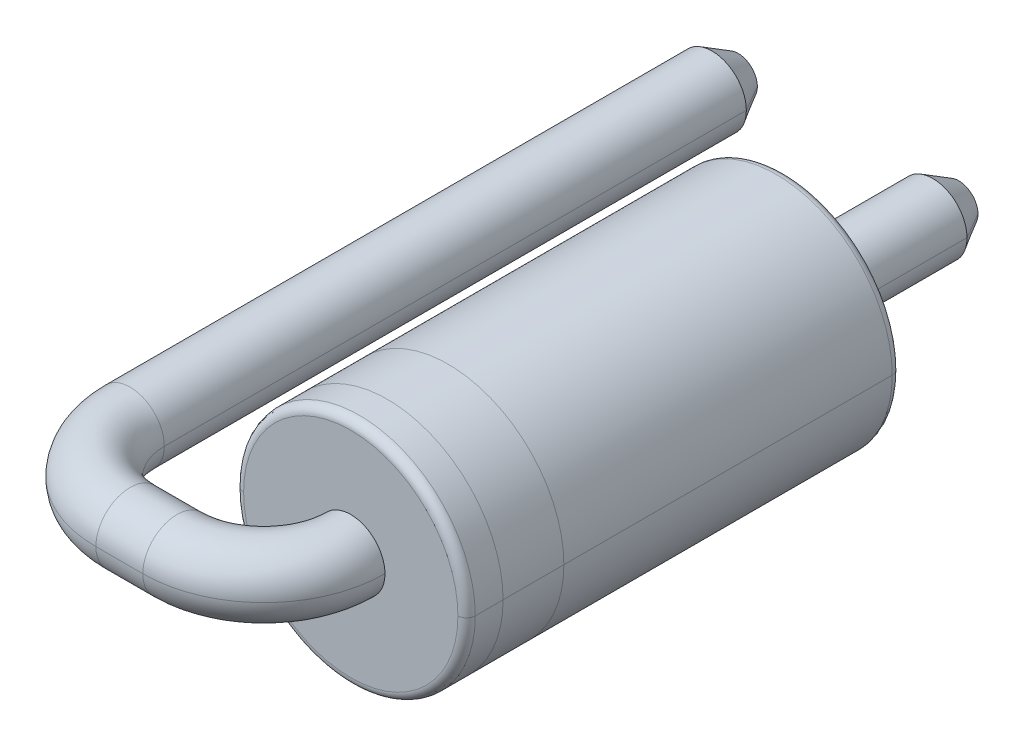
ISO-10303-21;
HEADER;
FILE_DESCRIPTION(('STEP AP214'),'2;1');
FILE_NAME('part.step','',(''),(''),'','','');
FILE_SCHEMA(('AUTOMOTIVE_DESIGN { 1 0 10303 214 1 1 1 1 }'));
ENDSEC;
DATA;
#1=APPLICATION_CONTEXT('core data for automotive mechanical design processes');
#2=APPLICATION_PROTOCOL_DEFINITION('international standard','automotive_design',2000,#1);
#3=PRODUCT_CONTEXT('',#1,'mechanical');
#4=PRODUCT('Part','Part','',(#3));
#5=PRODUCT_RELATED_PRODUCT_CATEGORY('part','',(#4));
#6=PRODUCT_DEFINITION_FORMATION('','',#4);
#7=PRODUCT_DEFINITION_CONTEXT('part definition',#1,'design');
#8=PRODUCT_DEFINITION('design','',#6,#7);
#9=PRODUCT_DEFINITION_SHAPE('','',#8);
#10=(LENGTH_UNIT() NAMED_UNIT(*) SI_UNIT(.MILLI.,.METRE.));
#11=(NAMED_UNIT(*) PLANE_ANGLE_UNIT() SI_UNIT($,.RADIAN.));
#12=(NAMED_UNIT(*) SI_UNIT($,.STERADIAN.) SOLID_ANGLE_UNIT());
#13=UNCERTAINTY_MEASURE_WITH_UNIT(LENGTH_MEASURE(1.E-05),#10,'distance_accuracy_value','');
#14=(GEOMETRIC_REPRESENTATION_CONTEXT(3) GLOBAL_UNCERTAINTY_ASSIGNED_CONTEXT((#13)) GLOBAL_UNIT_ASSIGNED_CONTEXT((#10,
#11,#12)) REPRESENTATION_CONTEXT('',''));
#15=CARTESIAN_POINT('',(0.,0.,0.));
#16=DIRECTION('',(0.,0.,1.));
#17=DIRECTION('',(1.,0.,0.));
#18=AXIS2_PLACEMENT_3D('',#15,#16,#17);
#19=CARTESIAN_POINT('',(0.308079680000001,-0.0636016000000001,4.99999892));
#20=DIRECTION('',(0.,-1.,0.));
#21=DIRECTION('',(0.,0.,-1.));
#22=AXIS2_PLACEMENT_3D('',#19,#20,#21);
#23=TOROIDAL_SURFACE('',#22,1.,0.393699999999999);
#24=CARTESIAN_POINT('',(1.30807968,-0.0636016000000003,4.99999892));
#25=DIRECTION('',(0.,0.,1.));
#26=DIRECTION('',(1.,0.,0.));
#27=AXIS2_PLACEMENT_3D('',#24,#25,#26);
#28=CIRCLE('',#27,0.393699999999999);
#29=CARTESIAN_POINT('',(0.914379680000001,-0.0636016000000002,4.99999892));
#30=VERTEX_POINT('',#29);
#31=CARTESIAN_POINT('',(1.70177968,-0.0636016000000004,4.99999892));
#32=VERTEX_POINT('',#31);
#33=EDGE_CURVE('E11',#30,#32,#28,.T.);
#34=ORIENTED_EDGE('',*,*,#33,.T.);
#35=CARTESIAN_POINT('',(0.308079680000001,-0.0636016000000001,4.99999892));
#36=DIRECTION('',(0.,-1.,0.));
#37=DIRECTION('',(0.,0.,-1.));
#38=AXIS2_PLACEMENT_3D('',#35,#36,#37);
#39=CIRCLE('',#38,1.3937);
#40=CARTESIAN_POINT('',(0.30807968,-0.0636016000000001,6.39369892));
#41=VERTEX_POINT('',#40);
#42=EDGE_CURVE('E23',#32,#41,#39,.T.);
#43=ORIENTED_EDGE('',*,*,#42,.T.);
#44=CARTESIAN_POINT('',(0.30807968,-0.0636016000000001,5.99999892));
#45=DIRECTION('',(-1.,0.,0.));
#46=DIRECTION('',(0.,0.,1.));
#47=AXIS2_PLACEMENT_3D('',#44,#45,#46);
#48=CIRCLE('',#47,0.393699999999999);
#49=CARTESIAN_POINT('',(0.30807968,-0.0636016,5.60629892));
#50=VERTEX_POINT('',#49);
#51=EDGE_CURVE('E256',#50,#41,#48,.T.);
#52=ORIENTED_EDGE('',*,*,#51,.F.);
#53=CARTESIAN_POINT('',(0.308079680000001,-0.0636016,4.99999892));
#54=DIRECTION('',(0.,-1.,0.));
#55=DIRECTION('',(0.,0.,-1.));
#56=AXIS2_PLACEMENT_3D('',#53,#54,#55);
#57=CIRCLE('',#56,0.606300000000001);
#58=EDGE_CURVE('E253',#30,#50,#57,.T.);
#59=ORIENTED_EDGE('',*,*,#58,.F.);
#60=EDGE_LOOP('',(#34,#43,#52,#59));
#61=FACE_BOUND('',#60,.T.);
#62=ADVANCED_FACE('F16',(#61),#23,.T.);
#63=CARTESIAN_POINT('',(-0.231920319999998,-0.0636015999999999,4.99999892));
#64=DIRECTION('',(0.,-1.,0.));
#65=DIRECTION('',(0.,0.,-1.));
#66=AXIS2_PLACEMENT_3D('',#63,#64,#65);
#67=TOROIDAL_SURFACE('',#66,1.,0.393699999999999);
#68=CARTESIAN_POINT('',(-0.231920319999999,-0.0636015999999999,5.99999892));
#69=DIRECTION('',(-1.,0.,0.));
#70=DIRECTION('',(0.,0.,1.));
#71=AXIS2_PLACEMENT_3D('',#68,#69,#70);
#72=CIRCLE('',#71,0.393699999999999);
#73=CARTESIAN_POINT('',(-0.231920319999999,-0.0636015999999999,5.60629892));
#74=VERTEX_POINT('',#73);
#75=CARTESIAN_POINT('',(-0.231920319999999,-0.0636015999999999,6.39369892));
#76=VERTEX_POINT('',#75);
#77=EDGE_CURVE('E251',#74,#76,#72,.T.);
#78=ORIENTED_EDGE('',*,*,#77,.T.);
#79=CARTESIAN_POINT('',(-0.231920319999998,-0.0636015999999999,4.99999892));
#80=DIRECTION('',(0.,-1.,0.));
#81=DIRECTION('',(0.,0.,-1.));
#82=AXIS2_PLACEMENT_3D('',#79,#80,#81);
#83=CIRCLE('',#82,1.3937);
#84=CARTESIAN_POINT('',(-1.62562032,-0.0636015999999996,4.99999892));
#85=VERTEX_POINT('',#84);
#86=EDGE_CURVE('E249',#76,#85,#83,.T.);
#87=ORIENTED_EDGE('',*,*,#86,.T.);
#88=CARTESIAN_POINT('',(-1.23192032,-0.0636015999999997,4.99999892));
#89=DIRECTION('',(0.,0.,-1.));
#90=DIRECTION('',(-1.,0.,0.));
#91=AXIS2_PLACEMENT_3D('',#88,#89,#90);
#92=CIRCLE('',#91,0.393699999999999);
#93=CARTESIAN_POINT('',(-0.838220320000001,-0.0636015999999997,4.99999892));
#94=VERTEX_POINT('',#93);
#95=EDGE_CURVE('E247',#94,#85,#92,.T.);
#96=ORIENTED_EDGE('',*,*,#95,.F.);
#97=CARTESIAN_POINT('',(-0.231920319999998,-0.0636015999999999,4.99999892));
#98=DIRECTION('',(0.,-1.,0.));
#99=DIRECTION('',(0.,0.,-1.));
#100=AXIS2_PLACEMENT_3D('',#97,#98,#99);
#101=CIRCLE('',#100,0.606300000000002);
#102=EDGE_CURVE('E244',#74,#94,#101,.T.);
#103=ORIENTED_EDGE('',*,*,#102,.F.);
#104=EDGE_LOOP('',(#78,#87,#96,#103));
#105=FACE_BOUND('',#104,.T.);
#106=ADVANCED_FACE('F273',(#105),#67,.T.);
#107=CARTESIAN_POINT('',(1.30807968,-0.0636016000000003,4.89999892));
#108=DIRECTION('',(0.,0.,1.));
#109=DIRECTION('',(1.,0.,0.));
#110=AXIS2_PLACEMENT_3D('',#107,#108,#109);
#111=TOROIDAL_SURFACE('',#110,1.2335,0.1);
#112=CARTESIAN_POINT('',(1.30807968,-0.0636016000000003,4.89999892));
#113=DIRECTION('',(0.,0.,-1.));
#114=DIRECTION('',(1.,0.,0.));
#115=AXIS2_PLACEMENT_3D('',#112,#113,#114);
#116=CIRCLE('',#115,1.3335);
#117=CARTESIAN_POINT('',(-0.0254203199999989,-0.0636016,4.89999892));
#118=VERTEX_POINT('',#117);
#119=CARTESIAN_POINT('',(2.64157968,-0.0636016000000004,4.89999892));
#120=VERTEX_POINT('',#119);
#121=EDGE_CURVE('E242',#118,#120,#116,.T.);
#122=ORIENTED_EDGE('',*,*,#121,.F.);
#123=CARTESIAN_POINT('',(0.0745796800000011,-0.0636015999999998,4.89999892));
#124=DIRECTION('',(0.,1.,0.));
#125=DIRECTION('',(-1.,0.,0.));
#126=AXIS2_PLACEMENT_3D('',#123,#124,#125);
#127=CIRCLE('',#126,0.1);
#128=CARTESIAN_POINT('',(0.0745796800000011,-0.0636015999999998,4.99999892));
#129=VERTEX_POINT('',#128);
#130=EDGE_CURVE('E240',#118,#129,#127,.T.);
#131=ORIENTED_EDGE('',*,*,#130,.T.);
#132=CARTESIAN_POINT('',(1.30807968,-0.0636016000000003,4.99999892));
#133=DIRECTION('',(0.,0.,1.));
#134=DIRECTION('',(1.,0.,0.));
#135=AXIS2_PLACEMENT_3D('',#132,#133,#134);
#136=CIRCLE('',#135,1.2335);
#137=CARTESIAN_POINT('',(2.54157968,-0.0636016000000006,4.99999892));
#138=VERTEX_POINT('',#137);
#139=EDGE_CURVE('E237',#138,#129,#136,.T.);
#140=ORIENTED_EDGE('',*,*,#139,.F.);
#141=CARTESIAN_POINT('',(2.54157968,-0.0636016000000006,4.89999892));
#142=DIRECTION('',(0.,-1.,0.));
#143=DIRECTION('',(0.,0.,-1.));
#144=AXIS2_PLACEMENT_3D('',#141,#142,#143);
#145=CIRCLE('',#144,0.1);
#146=EDGE_CURVE('E234',#120,#138,#145,.T.);
#147=ORIENTED_EDGE('',*,*,#146,.F.);
#148=EDGE_LOOP('',(#122,#131,#140,#147));
#149=FACE_BOUND('',#148,.T.);
#150=ADVANCED_FACE('F275',(#149),#111,.T.);
#151=CARTESIAN_POINT('',(1.30807968,-0.0636016000000003,0.09999892));
#152=DIRECTION('',(0.,0.,1.));
#153=DIRECTION('',(1.,0.,0.));
#154=AXIS2_PLACEMENT_3D('',#151,#152,#153);
#155=TOROIDAL_SURFACE('',#154,1.2335,0.1);
#156=CARTESIAN_POINT('',(1.30807968,-0.0636016000000003,-1.08000000009767E-06));
#157=DIRECTION('',(0.,0.,-1.));
#158=DIRECTION('',(1.,0.,0.));
#159=AXIS2_PLACEMENT_3D('',#156,#157,#158);
#160=CIRCLE('',#159,1.2335);
#161=CARTESIAN_POINT('',(0.0745796800000011,-0.0636015999999998,-1.08000000009767E-06));
#162=VERTEX_POINT('',#161);
#163=CARTESIAN_POINT('',(2.54157968,-0.0636016000000006,-1.08000000009767E-06));
#164=VERTEX_POINT('',#163);
#165=EDGE_CURVE('E231',#162,#164,#160,.T.);
#166=ORIENTED_EDGE('',*,*,#165,.F.);
#167=CARTESIAN_POINT('',(0.0745796800000011,-0.0636015999999998,0.09999892));
#168=DIRECTION('',(0.,1.,0.));
#169=DIRECTION('',(-1.,0.,0.));
#170=AXIS2_PLACEMENT_3D('',#167,#168,#169);
#171=CIRCLE('',#170,0.1);
#172=CARTESIAN_POINT('',(-0.0254203199999989,-0.0636016,0.09999892));
#173=VERTEX_POINT('',#172);
#174=EDGE_CURVE('E229',#162,#173,#171,.T.);
#175=ORIENTED_EDGE('',*,*,#174,.T.);
#176=CARTESIAN_POINT('',(1.30807968,-0.0636016000000003,0.09999892));
#177=DIRECTION('',(0.,0.,1.));
#178=DIRECTION('',(1.,0.,0.));
#179=AXIS2_PLACEMENT_3D('',#176,#177,#178);
#180=CIRCLE('',#179,1.3335);
#181=CARTESIAN_POINT('',(2.64157968,-0.0636016000000004,0.09999892));
#182=VERTEX_POINT('',#181);
#183=EDGE_CURVE('E226',#182,#173,#180,.T.);
#184=ORIENTED_EDGE('',*,*,#183,.F.);
#185=CARTESIAN_POINT('',(2.54157968,-0.0636016000000006,0.09999892));
#186=DIRECTION('',(0.,-1.,0.));
#187=DIRECTION('',(0.,0.,-1.));
#188=AXIS2_PLACEMENT_3D('',#185,#186,#187);
#189=CIRCLE('',#188,0.0999999999999998);
#190=EDGE_CURVE('E223',#164,#182,#189,.T.);
#191=ORIENTED_EDGE('',*,*,#190,.F.);
#192=EDGE_LOOP('',(#166,#175,#184,#191));
#193=FACE_BOUND('',#192,.T.);
#194=ADVANCED_FACE('F281',(#193),#155,.T.);
#195=CARTESIAN_POINT('',(1.30807968,-0.0636016000000003,4.99999892));
#196=DIRECTION('',(0.,0.,-1.));
#197=DIRECTION('',(-1.,0.,0.));
#198=AXIS2_PLACEMENT_3D('',#195,#196,#197);
#199=CYLINDRICAL_SURFACE('',#198,0.393699999999999);
#200=CARTESIAN_POINT('',(1.30807968,-0.0636016000000003,-1.08000000009767E-06));
#201=DIRECTION('',(0.,0.,1.));
#202=DIRECTION('',(1.,0.,0.));
#203=AXIS2_PLACEMENT_3D('',#200,#201,#202);
#204=CIRCLE('',#203,0.393699999999999);
#205=CARTESIAN_POINT('',(1.70177968,-0.0636016000000004,-1.08000000009767E-06));
#206=VERTEX_POINT('',#205);
#207=CARTESIAN_POINT('',(0.914379680000001,-0.0636016000000002,-1.08000000009767E-06));
#208=VERTEX_POINT('',#207);
#209=EDGE_CURVE('E221',#206,#208,#204,.T.);
#210=ORIENTED_EDGE('',*,*,#209,.F.);
#211=DIRECTION('',(0.,0.,-1.));
#212=VECTOR('',#211,1.);
#213=CARTESIAN_POINT('',(1.70177968,-0.0636016000000004,4.99999892));
#214=LINE('',#213,#212);
#215=CARTESIAN_POINT('',(1.70177968,-0.0636016000000004,-1.70000108));
#216=VERTEX_POINT('',#215);
#217=EDGE_CURVE('E219',#206,#216,#214,.T.);
#218=ORIENTED_EDGE('',*,*,#217,.T.);
#219=CARTESIAN_POINT('',(1.30807968,-0.0636016000000003,-1.70000108));
#220=DIRECTION('',(0.,0.,1.));
#221=DIRECTION('',(1.,0.,0.));
#222=AXIS2_PLACEMENT_3D('',#219,#220,#221);
#223=CIRCLE('',#222,0.393699999999999);
#224=CARTESIAN_POINT('',(0.91437968,-0.0636016000000002,-1.70000108));
#225=VERTEX_POINT('',#224);
#226=EDGE_CURVE('E217',#216,#225,#223,.T.);
#227=ORIENTED_EDGE('',*,*,#226,.T.);
#228=DIRECTION('',(0.,0.,-1.));
#229=VECTOR('',#228,1.);
#230=CARTESIAN_POINT('',(0.914379680000001,-0.0636016000000002,4.99999892));
#231=LINE('',#230,#229);
#232=EDGE_CURVE('E214',#208,#225,#231,.T.);
#233=ORIENTED_EDGE('',*,*,#232,.F.);
#234=EDGE_LOOP('',(#210,#218,#227,#233));
#235=FACE_BOUND('',#234,.T.);
#236=ADVANCED_FACE('F287',(#235),#199,.T.);
#237=CARTESIAN_POINT('',(1.30807968,-0.0636016000000003,-1.70000108));
#238=DIRECTION('',(0.,0.,1.));
#239=DIRECTION('',(1.,0.,0.));
#240=AXIS2_PLACEMENT_3D('',#237,#238,#239);
#241=CONICAL_SURFACE('',#240,0.393699999999999,0.523598775598298);
#242=CARTESIAN_POINT('',(1.30807968,-0.0636016000000003,-2.00000108));
#243=DIRECTION('',(0.,0.,-1.));
#244=DIRECTION('',(1.,0.,0.));
#245=AXIS2_PLACEMENT_3D('',#242,#243,#244);
#246=CIRCLE('',#245,0.220494919243112);
#247=CARTESIAN_POINT('',(1.08758476075689,-0.0636016000000002,-2.00000108));
#248=VERTEX_POINT('',#247);
#249=CARTESIAN_POINT('',(1.52857459924311,-0.0636016000000004,-2.00000108));
#250=VERTEX_POINT('',#249);
#251=EDGE_CURVE('E212',#248,#250,#246,.T.);
#252=ORIENTED_EDGE('',*,*,#251,.F.);
#253=DIRECTION('',(-0.499999999999999,0.,0.866025403784439));
#254=VECTOR('',#253,1.);
#255=CARTESIAN_POINT('',(0.91437968,-0.0636016000000002,-1.70000108));
#256=LINE('',#255,#254);
#257=EDGE_CURVE('E209',#248,#225,#256,.T.);
#258=ORIENTED_EDGE('',*,*,#257,.T.);
#259=ORIENTED_EDGE('',*,*,#226,.F.);
#260=DIRECTION('',(0.499999999999999,0.,0.866025403784439));
#261=VECTOR('',#260,1.);
#262=CARTESIAN_POINT('',(1.70177968,-0.0636016000000004,-1.70000108));
#263=LINE('',#262,#261);
#264=EDGE_CURVE('E206',#250,#216,#263,.T.);
#265=ORIENTED_EDGE('',*,*,#264,.F.);
#266=EDGE_LOOP('',(#252,#258,#259,#265));
#267=FACE_BOUND('',#266,.T.);
#268=ADVANCED_FACE('F291',(#267),#241,.T.);
#269=CARTESIAN_POINT('',(1.30807968,-0.0636016000000003,4.99999892));
#270=DIRECTION('',(0.,0.,-1.));
#271=DIRECTION('',(-1.,0.,0.));
#272=AXIS2_PLACEMENT_3D('',#269,#270,#271);
#273=CYLINDRICAL_SURFACE('',#272,1.3335);
#274=CARTESIAN_POINT('',(1.30807968,-0.0636016000000003,4.58021291768316));
#275=DIRECTION('',(0.,0.,-1.));
#276=DIRECTION('',(-1.,0.,0.));
#277=AXIS2_PLACEMENT_3D('',#274,#275,#276);
#278=CIRCLE('',#277,1.3335);
#279=CARTESIAN_POINT('',(-0.0254203199999989,-0.0636016,4.58021291768316));
#280=VERTEX_POINT('',#279);
#281=CARTESIAN_POINT('',(2.64157968,-0.0636016000000004,4.58021291768316));
#282=VERTEX_POINT('',#281);
#283=EDGE_CURVE('E204',#280,#282,#278,.T.);
#284=ORIENTED_EDGE('',*,*,#283,.T.);
#285=DIRECTION('',(0.,0.,-1.));
#286=VECTOR('',#285,1.);
#287=CARTESIAN_POINT('',(2.64157968,-0.0636016000000004,4.99999892));
#288=LINE('',#287,#286);
#289=CARTESIAN_POINT('',(2.64157968,-0.0636016000000004,3.88021291768316));
#290=VERTEX_POINT('',#289);
#291=EDGE_CURVE('E201',#282,#290,#288,.T.);
#292=ORIENTED_EDGE('',*,*,#291,.T.);
#293=CARTESIAN_POINT('',(1.30807968,-0.0636016000000003,3.88021291768316));
#294=DIRECTION('',(0.,0.,1.));
#295=DIRECTION('',(1.,0.,0.));
#296=AXIS2_PLACEMENT_3D('',#293,#294,#295);
#297=CIRCLE('',#296,1.3335);
#298=CARTESIAN_POINT('',(-0.0254203199999989,-0.0636016,3.88021291768316));
#299=VERTEX_POINT('',#298);
#300=EDGE_CURVE('E199',#290,#299,#297,.T.);
#301=ORIENTED_EDGE('',*,*,#300,.T.);
#302=DIRECTION('',(0.,0.,-1.));
#303=VECTOR('',#302,1.);
#304=CARTESIAN_POINT('',(-0.0254203199999989,-0.0636016,4.99999892));
#305=LINE('',#304,#303);
#306=EDGE_CURVE('E196',#280,#299,#305,.T.);
#307=ORIENTED_EDGE('',*,*,#306,.F.);
#308=EDGE_LOOP('',(#284,#292,#301,#307));
#309=FACE_BOUND('',#308,.T.);
#310=ADVANCED_FACE('F295',(#309),#273,.T.);
#311=CARTESIAN_POINT('',(-1.23192032000521,-0.0636015999999997,-2.00000108));
#312=DIRECTION('',(7.44485491774011E-13,0.,1.));
#313=DIRECTION('',(1.,0.,-7.44485491774011E-13));
#314=AXIS2_PLACEMENT_3D('',#311,#312,#313);
#315=CONICAL_SURFACE('',#314,0.220494919243632,0.523598775597366);
#316=CARTESIAN_POINT('',(-1.23192032000521,-0.0636015999999997,-2.00000108));
#317=DIRECTION('',(0.,0.,-1.));
#318=DIRECTION('',(-1.,0.,0.));
#319=AXIS2_PLACEMENT_3D('',#316,#317,#318);
#320=CIRCLE('',#319,0.220494919243537);
#321=CARTESIAN_POINT('',(-1.45241523924875,-0.0636015999999996,-2.00000108));
#322=VERTEX_POINT('',#321);
#323=CARTESIAN_POINT('',(-1.01142540076167,-0.0636015999999997,-2.00000108));
#324=VERTEX_POINT('',#323);
#325=EDGE_CURVE('E194',#322,#324,#320,.T.);
#326=ORIENTED_EDGE('',*,*,#325,.F.);
#327=DIRECTION('',(-0.499999999998547,0.,0.866025403785277));
#328=VECTOR('',#327,1.);
#329=CARTESIAN_POINT('',(-1.45241523924884,-0.0636015999999996,-2.00000107999984));
#330=LINE('',#329,#328);
#331=CARTESIAN_POINT('',(-1.62562032000499,-0.0636015999999996,-1.70000107999996));
#332=VERTEX_POINT('',#331);
#333=EDGE_CURVE('E124',#322,#332,#330,.T.);
#334=ORIENTED_EDGE('',*,*,#333,.T.);
#335=CARTESIAN_POINT('',(-1.23192032000499,-0.0636015999999997,-1.70000108000025));
#336=DIRECTION('',(7.44485491774011E-13,0.,1.));
#337=DIRECTION('',(-1.,0.,7.44485491774011E-13));
#338=AXIS2_PLACEMENT_3D('',#335,#336,#337);
#339=CIRCLE('',#338,0.393699999999999);
#340=CARTESIAN_POINT('',(-0.83822032000499,-0.0636015999999997,-1.70000108000055));
#341=VERTEX_POINT('',#340);
#342=EDGE_CURVE('E118',#341,#332,#339,.T.);
#343=ORIENTED_EDGE('',*,*,#342,.F.);
#344=DIRECTION('',(0.499999999999837,0.,0.866025403784533));
#345=VECTOR('',#344,1.);
#346=CARTESIAN_POINT('',(-1.01142540076158,-0.0636015999999997,-2.00000108000016));
#347=LINE('',#346,#345);
#348=EDGE_CURVE('E121',#324,#341,#347,.T.);
#349=ORIENTED_EDGE('',*,*,#348,.F.);
#350=EDGE_LOOP('',(#326,#334,#343,#349));
#351=FACE_BOUND('',#350,.T.);
#352=ADVANCED_FACE('F120',(#351),#315,.T.);
#353=CARTESIAN_POINT('',(0.30807968,-0.0636016000000001,5.99999892));
#354=DIRECTION('',(-1.,0.,0.));
#355=DIRECTION('',(0.,0.,1.));
#356=AXIS2_PLACEMENT_3D('',#353,#354,#355);
#357=CYLINDRICAL_SURFACE('',#356,0.393699999999999);
#358=CARTESIAN_POINT('',(0.30807968,-0.0636016000000001,5.99999892));
#359=DIRECTION('',(-1.,0.,0.));
#360=DIRECTION('',(0.,0.,1.));
#361=AXIS2_PLACEMENT_3D('',#358,#359,#360);
#362=CIRCLE('',#361,0.393699999999999);
#363=EDGE_CURVE('E137',#41,#50,#362,.T.);
#364=ORIENTED_EDGE('',*,*,#363,.T.);
#365=DIRECTION('',(-1.,0.,0.));
#366=VECTOR('',#365,1.);
#367=CARTESIAN_POINT('',(0.308079679999999,-0.0636016,5.60629892));
#368=LINE('',#367,#366);
#369=EDGE_CURVE('E188',#50,#74,#368,.T.);
#370=ORIENTED_EDGE('',*,*,#369,.T.);
#371=CARTESIAN_POINT('',(-0.231920319999999,-0.0636015999999999,5.99999892));
#372=DIRECTION('',(-1.,0.,0.));
#373=DIRECTION('',(0.,0.,1.));
#374=AXIS2_PLACEMENT_3D('',#371,#372,#373);
#375=CIRCLE('',#374,0.393699999999999);
#376=EDGE_CURVE('E185',#76,#74,#375,.T.);
#377=ORIENTED_EDGE('',*,*,#376,.F.);
#378=DIRECTION('',(-1.,0.,0.));
#379=VECTOR('',#378,1.);
#380=CARTESIAN_POINT('',(0.308079680000002,-0.0636016000000001,6.39369892));
#381=LINE('',#380,#379);
#382=EDGE_CURVE('E182',#41,#76,#381,.T.);
#383=ORIENTED_EDGE('',*,*,#382,.F.);
#384=EDGE_LOOP('',(#364,#370,#377,#383));
#385=FACE_BOUND('',#384,.T.);
#386=ADVANCED_FACE('F267',(#385),#357,.T.);
#387=CARTESIAN_POINT('',(-1.23192032,-0.0636015999999997,4.99999892));
#388=DIRECTION('',(-7.44568097653188E-13,0.,-1.));
#389=DIRECTION('',(-1.,0.,7.44568097653188E-13));
#390=AXIS2_PLACEMENT_3D('',#387,#388,#389);
#391=CYLINDRICAL_SURFACE('',#390,0.393699999999999);
#392=CARTESIAN_POINT('',(-1.23192032,-0.0636015999999997,4.99999892));
#393=DIRECTION('',(0.,0.,-1.));
#394=DIRECTION('',(-1.,0.,0.));
#395=AXIS2_PLACEMENT_3D('',#392,#393,#394);
#396=CIRCLE('',#395,0.393699999999999);
#397=EDGE_CURVE('E144',#85,#94,#396,.T.);
#398=ORIENTED_EDGE('',*,*,#397,.T.);
#399=DIRECTION('',(-7.44568097653188E-13,0.,-1.));
#400=VECTOR('',#399,1.);
#401=CARTESIAN_POINT('',(-0.838220320000001,-0.0636015999999997,4.99999891999971));
#402=LINE('',#401,#400);
#403=EDGE_CURVE('E141',#94,#341,#402,.T.);
#404=ORIENTED_EDGE('',*,*,#403,.T.);
#405=ORIENTED_EDGE('',*,*,#342,.T.);
#406=DIRECTION('',(-7.44568097653188E-13,0.,-1.));
#407=VECTOR('',#406,1.);
#408=CARTESIAN_POINT('',(-1.62562032,-0.0636015999999996,4.99999892000029));
#409=LINE('',#408,#407);
#410=EDGE_CURVE('E147',#85,#332,#409,.T.);
#411=ORIENTED_EDGE('',*,*,#410,.F.);
#412=EDGE_LOOP('',(#398,#404,#405,#411));
#413=FACE_BOUND('',#412,.T.);
#414=ADVANCED_FACE('F142',(#413),#391,.T.);
#415=CARTESIAN_POINT('',(1.30807968,-0.0636016000000003,4.99999892));
#416=DIRECTION('',(0.,0.,-1.));
#417=DIRECTION('',(-1.,0.,0.));
#418=AXIS2_PLACEMENT_3D('',#415,#416,#417);
#419=CYLINDRICAL_SURFACE('',#418,1.3335);
#420=ORIENTED_EDGE('',*,*,#121,.T.);
#421=DIRECTION('',(0.,0.,-1.));
#422=VECTOR('',#421,1.);
#423=CARTESIAN_POINT('',(2.64157968,-0.0636016000000004,4.99999892));
#424=LINE('',#423,#422);
#425=EDGE_CURVE('E177',#120,#282,#424,.T.);
#426=ORIENTED_EDGE('',*,*,#425,.T.);
#427=ORIENTED_EDGE('',*,*,#283,.F.);
#428=DIRECTION('',(0.,0.,-1.));
#429=VECTOR('',#428,1.);
#430=CARTESIAN_POINT('',(-0.0254203199999989,-0.0636016,4.99999892));
#431=LINE('',#430,#429);
#432=EDGE_CURVE('E174',#118,#280,#431,.T.);
#433=ORIENTED_EDGE('',*,*,#432,.F.);
#434=EDGE_LOOP('',(#420,#426,#427,#433));
#435=FACE_BOUND('',#434,.T.);
#436=ADVANCED_FACE('F306',(#435),#419,.T.);
#437=CARTESIAN_POINT('',(1.30807968,-0.0636016000000003,4.99999892));
#438=DIRECTION('',(0.,0.,-1.));
#439=DIRECTION('',(-1.,0.,0.));
#440=AXIS2_PLACEMENT_3D('',#437,#438,#439);
#441=CYLINDRICAL_SURFACE('',#440,1.3335);
#442=ORIENTED_EDGE('',*,*,#300,.F.);
#443=DIRECTION('',(0.,0.,-1.));
#444=VECTOR('',#443,1.);
#445=CARTESIAN_POINT('',(2.64157968,-0.0636016000000004,4.99999892));
#446=LINE('',#445,#444);
#447=EDGE_CURVE('E171',#290,#182,#446,.T.);
#448=ORIENTED_EDGE('',*,*,#447,.T.);
#449=ORIENTED_EDGE('',*,*,#183,.T.);
#450=DIRECTION('',(0.,0.,-1.));
#451=VECTOR('',#450,1.);
#452=CARTESIAN_POINT('',(-0.0254203199999989,-0.0636016,4.99999892));
#453=LINE('',#452,#451);
#454=EDGE_CURVE('E168',#299,#173,#453,.T.);
#455=ORIENTED_EDGE('',*,*,#454,.F.);
#456=EDGE_LOOP('',(#442,#448,#449,#455));
#457=FACE_BOUND('',#456,.T.);
#458=ADVANCED_FACE('F309',(#457),#441,.T.);
#459=CARTESIAN_POINT('',(1.30807968,-0.0636016000000003,4.99999892));
#460=DIRECTION('',(0.,0.,-1.));
#461=DIRECTION('',(-1.,0.,0.));
#462=AXIS2_PLACEMENT_3D('',#459,#460,#461);
#463=CYLINDRICAL_SURFACE('',#462,1.3335);
#464=ORIENTED_EDGE('',*,*,#447,.F.);
#465=CARTESIAN_POINT('',(1.30807968,-0.0636016000000003,3.88021291768316));
#466=DIRECTION('',(0.,0.,1.));
#467=DIRECTION('',(1.,0.,0.));
#468=AXIS2_PLACEMENT_3D('',#465,#466,#467);
#469=CIRCLE('',#468,1.3335);
#470=EDGE_CURVE('E165',#299,#290,#469,.T.);
#471=ORIENTED_EDGE('',*,*,#470,.F.);
#472=ORIENTED_EDGE('',*,*,#454,.T.);
#473=CARTESIAN_POINT('',(1.30807968,-0.0636016000000003,0.09999892));
#474=DIRECTION('',(0.,0.,1.));
#475=DIRECTION('',(1.,0.,0.));
#476=AXIS2_PLACEMENT_3D('',#473,#474,#475);
#477=CIRCLE('',#476,1.3335);
#478=EDGE_CURVE('E162',#173,#182,#477,.T.);
#479=ORIENTED_EDGE('',*,*,#478,.T.);
#480=EDGE_LOOP('',(#464,#471,#472,#479));
#481=FACE_BOUND('',#480,.T.);
#482=ADVANCED_FACE('F313',(#481),#463,.T.);
#483=CARTESIAN_POINT('',(1.30807968,-0.0636016000000003,4.99999892));
#484=DIRECTION('',(0.,0.,-1.));
#485=DIRECTION('',(-1.,0.,0.));
#486=AXIS2_PLACEMENT_3D('',#483,#484,#485);
#487=CYLINDRICAL_SURFACE('',#486,1.3335);
#488=ORIENTED_EDGE('',*,*,#425,.F.);
#489=CARTESIAN_POINT('',(1.30807968,-0.0636016000000003,4.89999892));
#490=DIRECTION('',(0.,0.,-1.));
#491=DIRECTION('',(1.,0.,0.));
#492=AXIS2_PLACEMENT_3D('',#489,#490,#491);
#493=CIRCLE('',#492,1.3335);
#494=EDGE_CURVE('E154',#120,#118,#493,.T.);
#495=ORIENTED_EDGE('',*,*,#494,.T.);
#496=ORIENTED_EDGE('',*,*,#432,.T.);
#497=CARTESIAN_POINT('',(1.30807968,-0.0636016000000003,4.58021291768316));
#498=DIRECTION('',(0.,0.,-1.));
#499=DIRECTION('',(-1.,0.,0.));
#500=AXIS2_PLACEMENT_3D('',#497,#498,#499);
#501=CIRCLE('',#500,1.3335);
#502=EDGE_CURVE('E150',#282,#280,#501,.T.);
#503=ORIENTED_EDGE('',*,*,#502,.F.);
#504=EDGE_LOOP('',(#488,#495,#496,#503));
#505=FACE_BOUND('',#504,.T.);
#506=ADVANCED_FACE('F317',(#505),#487,.T.);
#507=CARTESIAN_POINT('',(-1.23192032,-0.0636015999999997,4.99999892));
#508=DIRECTION('',(-7.44568097653188E-13,0.,-1.));
#509=DIRECTION('',(-1.,0.,7.44568097653188E-13));
#510=AXIS2_PLACEMENT_3D('',#507,#508,#509);
#511=CYLINDRICAL_SURFACE('',#510,0.393699999999999);
#512=ORIENTED_EDGE('',*,*,#403,.F.);
#513=ORIENTED_EDGE('',*,*,#95,.T.);
#514=ORIENTED_EDGE('',*,*,#410,.T.);
#515=CARTESIAN_POINT('',(-1.23192032000499,-0.0636015999999997,-1.70000108000025));
#516=DIRECTION('',(7.44485491774011E-13,0.,1.));
#517=DIRECTION('',(-1.,0.,7.44485491774011E-13));
#518=AXIS2_PLACEMENT_3D('',#515,#516,#517);
#519=CIRCLE('',#518,0.393699999999999);
#520=EDGE_CURVE('E134',#332,#341,#519,.T.);
#521=ORIENTED_EDGE('',*,*,#520,.T.);
#522=EDGE_LOOP('',(#512,#513,#514,#521));
#523=FACE_BOUND('',#522,.T.);
#524=ADVANCED_FACE('F149',(#523),#511,.T.);
#525=CARTESIAN_POINT('',(-0.231920319999998,-0.0636015999999999,4.99999892));
#526=DIRECTION('',(0.,-1.,0.));
#527=DIRECTION('',(0.,0.,-1.));
#528=AXIS2_PLACEMENT_3D('',#525,#526,#527);
#529=TOROIDAL_SURFACE('',#528,1.,0.393699999999999);
#530=ORIENTED_EDGE('',*,*,#86,.F.);
#531=ORIENTED_EDGE('',*,*,#376,.T.);
#532=ORIENTED_EDGE('',*,*,#102,.T.);
#533=ORIENTED_EDGE('',*,*,#397,.F.);
#534=EDGE_LOOP('',(#530,#531,#532,#533));
#535=FACE_BOUND('',#534,.T.);
#536=ADVANCED_FACE('F271',(#535),#529,.T.);
#537=CARTESIAN_POINT('',(0.30807968,-0.0636016000000001,5.99999892));
#538=DIRECTION('',(-1.,0.,0.));
#539=DIRECTION('',(0.,0.,1.));
#540=AXIS2_PLACEMENT_3D('',#537,#538,#539);
#541=CYLINDRICAL_SURFACE('',#540,0.393699999999999);
#542=ORIENTED_EDGE('',*,*,#369,.F.);
#543=ORIENTED_EDGE('',*,*,#51,.T.);
#544=ORIENTED_EDGE('',*,*,#382,.T.);
#545=ORIENTED_EDGE('',*,*,#77,.F.);
#546=EDGE_LOOP('',(#542,#543,#544,#545));
#547=FACE_BOUND('',#546,.T.);
#548=ADVANCED_FACE('F262',(#547),#541,.T.);
#549=CARTESIAN_POINT('',(0.308079680000001,-0.0636016000000001,4.99999892));
#550=DIRECTION('',(0.,-1.,0.));
#551=DIRECTION('',(0.,0.,-1.));
#552=AXIS2_PLACEMENT_3D('',#549,#550,#551);
#553=TOROIDAL_SURFACE('',#552,1.,0.393699999999999);
#554=ORIENTED_EDGE('',*,*,#42,.F.);
#555=CARTESIAN_POINT('',(1.30807968,-0.0636016000000003,4.99999892));
#556=DIRECTION('',(0.,0.,1.));
#557=DIRECTION('',(1.,0.,0.));
#558=AXIS2_PLACEMENT_3D('',#555,#556,#557);
#559=CIRCLE('',#558,0.393699999999999);
#560=EDGE_CURVE('E151',#32,#30,#559,.T.);
#561=ORIENTED_EDGE('',*,*,#560,.T.);
#562=ORIENTED_EDGE('',*,*,#58,.T.);
#563=ORIENTED_EDGE('',*,*,#363,.F.);
#564=EDGE_LOOP('',(#554,#561,#562,#563));
#565=FACE_BOUND('',#564,.T.);
#566=ADVANCED_FACE('F264',(#565),#553,.T.);
#567=CARTESIAN_POINT('',(-1.23192032000521,-0.0636015999999997,-2.00000108));
#568=DIRECTION('',(0.,0.,-1.));
#569=DIRECTION('',(-1.,0.,0.));
#570=AXIS2_PLACEMENT_3D('',#567,#568,#569);
#571=PLANE('',#570);
#572=CARTESIAN_POINT('',(-1.23192032000521,-0.0636015999999997,-2.00000108));
#573=DIRECTION('',(0.,0.,-1.));
#574=DIRECTION('',(-1.,0.,0.));
#575=AXIS2_PLACEMENT_3D('',#572,#573,#574);
#576=CIRCLE('',#575,0.220494919243537);
#577=EDGE_CURVE('E136',#324,#322,#576,.T.);
#578=ORIENTED_EDGE('',*,*,#577,.T.);
#579=ORIENTED_EDGE('',*,*,#325,.T.);
#580=EDGE_LOOP('',(#578,#579));
#581=FACE_BOUND('',#580,.T.);
#582=ADVANCED_FACE('F330',(#581),#571,.T.);
#583=CARTESIAN_POINT('',(-1.23192032000521,-0.0636015999999997,-2.00000108));
#584=DIRECTION('',(7.44485491774011E-13,0.,1.));
#585=DIRECTION('',(1.,0.,-7.44485491774011E-13));
#586=AXIS2_PLACEMENT_3D('',#583,#584,#585);
#587=CONICAL_SURFACE('',#586,0.220494919243632,0.523598775597366);
#588=ORIENTED_EDGE('',*,*,#333,.F.);
#589=ORIENTED_EDGE('',*,*,#577,.F.);
#590=ORIENTED_EDGE('',*,*,#348,.T.);
#591=ORIENTED_EDGE('',*,*,#520,.F.);
#592=EDGE_LOOP('',(#588,#589,#590,#591));
#593=FACE_BOUND('',#592,.T.);
#594=ADVANCED_FACE('F132',(#593),#587,.T.);
#595=CARTESIAN_POINT('',(1.30807968,-0.0636016000000003,4.99999892));
#596=DIRECTION('',(0.,0.,1.));
#597=DIRECTION('',(1.,0.,0.));
#598=AXIS2_PLACEMENT_3D('',#595,#596,#597);
#599=PLANE('',#598);
#600=ORIENTED_EDGE('',*,*,#139,.T.);
#601=CARTESIAN_POINT('',(1.30807968,-0.0636016000000003,4.99999892));
#602=DIRECTION('',(0.,0.,1.));
#603=DIRECTION('',(1.,0.,0.));
#604=AXIS2_PLACEMENT_3D('',#601,#602,#603);
#605=CIRCLE('',#604,1.2335);
#606=EDGE_CURVE('E374',#129,#138,#605,.T.);
#607=ORIENTED_EDGE('',*,*,#606,.T.);
#608=EDGE_LOOP('',(#600,#607));
#609=FACE_BOUND('',#608,.T.);
#610=ORIENTED_EDGE('',*,*,#33,.F.);
#611=ORIENTED_EDGE('',*,*,#560,.F.);
#612=EDGE_LOOP('',(#610,#611));
#613=FACE_BOUND('',#612,.T.);
#614=ADVANCED_FACE('F336',(#609,#613),#599,.T.);
#615=CARTESIAN_POINT('',(1.30807968,-0.0636016000000003,-1.08000000009767E-06));
#616=DIRECTION('',(0.,0.,1.));
#617=DIRECTION('',(1.,0.,0.));
#618=AXIS2_PLACEMENT_3D('',#615,#616,#617);
#619=PLANE('',#618);
#620=CARTESIAN_POINT('',(1.30807968,-0.0636016000000003,-1.08000000009767E-06));
#621=DIRECTION('',(0.,0.,-1.));
#622=DIRECTION('',(1.,0.,0.));
#623=AXIS2_PLACEMENT_3D('',#620,#621,#622);
#624=CIRCLE('',#623,1.2335);
#625=EDGE_CURVE('E380',#164,#162,#624,.T.);
#626=ORIENTED_EDGE('',*,*,#625,.T.);
#627=ORIENTED_EDGE('',*,*,#165,.T.);
#628=EDGE_LOOP('',(#626,#627));
#629=FACE_BOUND('',#628,.T.);
#630=CARTESIAN_POINT('',(1.30807968,-0.0636016000000003,-1.08000000009767E-06));
#631=DIRECTION('',(0.,0.,1.));
#632=DIRECTION('',(1.,0.,0.));
#633=AXIS2_PLACEMENT_3D('',#630,#631,#632);
#634=CIRCLE('',#633,0.393699999999999);
#635=EDGE_CURVE('E383',#208,#206,#634,.T.);
#636=ORIENTED_EDGE('',*,*,#635,.T.);
#637=ORIENTED_EDGE('',*,*,#209,.T.);
#638=EDGE_LOOP('',(#636,#637));
#639=FACE_BOUND('',#638,.T.);
#640=ADVANCED_FACE('F339',(#629,#639),#619,.F.);
#641=CARTESIAN_POINT('',(1.30807968,-0.0636016000000003,4.99999892));
#642=DIRECTION('',(0.,0.,-1.));
#643=DIRECTION('',(-1.,0.,0.));
#644=AXIS2_PLACEMENT_3D('',#641,#642,#643);
#645=CYLINDRICAL_SURFACE('',#644,1.3335);
#646=ORIENTED_EDGE('',*,*,#291,.F.);
#647=ORIENTED_EDGE('',*,*,#502,.T.);
#648=ORIENTED_EDGE('',*,*,#306,.T.);
#649=ORIENTED_EDGE('',*,*,#470,.T.);
#650=EDGE_LOOP('',(#646,#647,#648,#649));
#651=FACE_BOUND('',#650,.T.);
#652=ADVANCED_FACE('F343',(#651),#645,.T.);
#653=CARTESIAN_POINT('',(1.30807968,-0.0636016000000003,-2.00000108));
#654=DIRECTION('',(0.,0.,1.));
#655=DIRECTION('',(1.,0.,0.));
#656=AXIS2_PLACEMENT_3D('',#653,#654,#655);
#657=PLANE('',#656);
#658=CARTESIAN_POINT('',(1.30807968,-0.0636016000000003,-2.00000108));
#659=DIRECTION('',(0.,0.,-1.));
#660=DIRECTION('',(1.,0.,0.));
#661=AXIS2_PLACEMENT_3D('',#658,#659,#660);
#662=CIRCLE('',#661,0.220494919243112);
#663=EDGE_CURVE('E388',#250,#248,#662,.T.);
#664=ORIENTED_EDGE('',*,*,#663,.T.);
#665=ORIENTED_EDGE('',*,*,#251,.T.);
#666=EDGE_LOOP('',(#664,#665));
#667=FACE_BOUND('',#666,.T.);
#668=ADVANCED_FACE('F347',(#667),#657,.F.);
#669=CARTESIAN_POINT('',(1.30807968,-0.0636016000000003,-1.70000108));
#670=DIRECTION('',(0.,0.,1.));
#671=DIRECTION('',(1.,0.,0.));
#672=AXIS2_PLACEMENT_3D('',#669,#670,#671);
#673=CONICAL_SURFACE('',#672,0.393699999999999,0.523598775598298);
#674=ORIENTED_EDGE('',*,*,#257,.F.);
#675=ORIENTED_EDGE('',*,*,#663,.F.);
#676=ORIENTED_EDGE('',*,*,#264,.T.);
#677=CARTESIAN_POINT('',(1.30807968,-0.0636016000000003,-1.70000108));
#678=DIRECTION('',(0.,0.,1.));
#679=DIRECTION('',(1.,0.,0.));
#680=AXIS2_PLACEMENT_3D('',#677,#678,#679);
#681=CIRCLE('',#680,0.393699999999999);
#682=EDGE_CURVE('E391',#225,#216,#681,.T.);
#683=ORIENTED_EDGE('',*,*,#682,.F.);
#684=EDGE_LOOP('',(#674,#675,#676,#683));
#685=FACE_BOUND('',#684,.T.);
#686=ADVANCED_FACE('F351',(#685),#673,.T.);
#687=CARTESIAN_POINT('',(1.30807968,-0.0636016000000003,4.99999892));
#688=DIRECTION('',(0.,0.,-1.));
#689=DIRECTION('',(-1.,0.,0.));
#690=AXIS2_PLACEMENT_3D('',#687,#688,#689);
#691=CYLINDRICAL_SURFACE('',#690,0.393699999999999);
#692=ORIENTED_EDGE('',*,*,#217,.F.);
#693=ORIENTED_EDGE('',*,*,#635,.F.);
#694=ORIENTED_EDGE('',*,*,#232,.T.);
#695=ORIENTED_EDGE('',*,*,#682,.T.);
#696=EDGE_LOOP('',(#692,#693,#694,#695));
#697=FACE_BOUND('',#696,.T.);
#698=ADVANCED_FACE('F355',(#697),#691,.T.);
#699=CARTESIAN_POINT('',(1.30807968,-0.0636016000000003,0.09999892));
#700=DIRECTION('',(0.,0.,1.));
#701=DIRECTION('',(1.,0.,0.));
#702=AXIS2_PLACEMENT_3D('',#699,#700,#701);
#703=TOROIDAL_SURFACE('',#702,1.2335,0.1);
#704=ORIENTED_EDGE('',*,*,#174,.F.);
#705=ORIENTED_EDGE('',*,*,#625,.F.);
#706=ORIENTED_EDGE('',*,*,#190,.T.);
#707=ORIENTED_EDGE('',*,*,#478,.F.);
#708=EDGE_LOOP('',(#704,#705,#706,#707));
#709=FACE_BOUND('',#708,.T.);
#710=ADVANCED_FACE('F359',(#709),#703,.T.);
#711=CARTESIAN_POINT('',(1.30807968,-0.0636016000000003,4.89999892));
#712=DIRECTION('',(0.,0.,1.));
#713=DIRECTION('',(1.,0.,0.));
#714=AXIS2_PLACEMENT_3D('',#711,#712,#713);
#715=TOROIDAL_SURFACE('',#714,1.2335,0.1);
#716=ORIENTED_EDGE('',*,*,#130,.F.);
#717=ORIENTED_EDGE('',*,*,#494,.F.);
#718=ORIENTED_EDGE('',*,*,#146,.T.);
#719=ORIENTED_EDGE('',*,*,#606,.F.);
#720=EDGE_LOOP('',(#716,#717,#718,#719));
#721=FACE_BOUND('',#720,.T.);
#722=ADVANCED_FACE('F363',(#721),#715,.T.);
#723=CLOSED_SHELL('',(#62,#106,#150,#194,#236,#268,#310,#352,#386,#414,#436,#458,#482,#506,#524,
#536,#548,#566,#582,#594,#614,#640,#652,#668,#686,#698,#710,#722));
#724=MANIFOLD_SOLID_BREP('B1',#723);
#725=ADVANCED_BREP_SHAPE_REPRESENTATION('',(#18,#724),#14);
#726=SHAPE_DEFINITION_REPRESENTATION(#9,#725);
ENDSEC;
END-ISO-10303-21;
